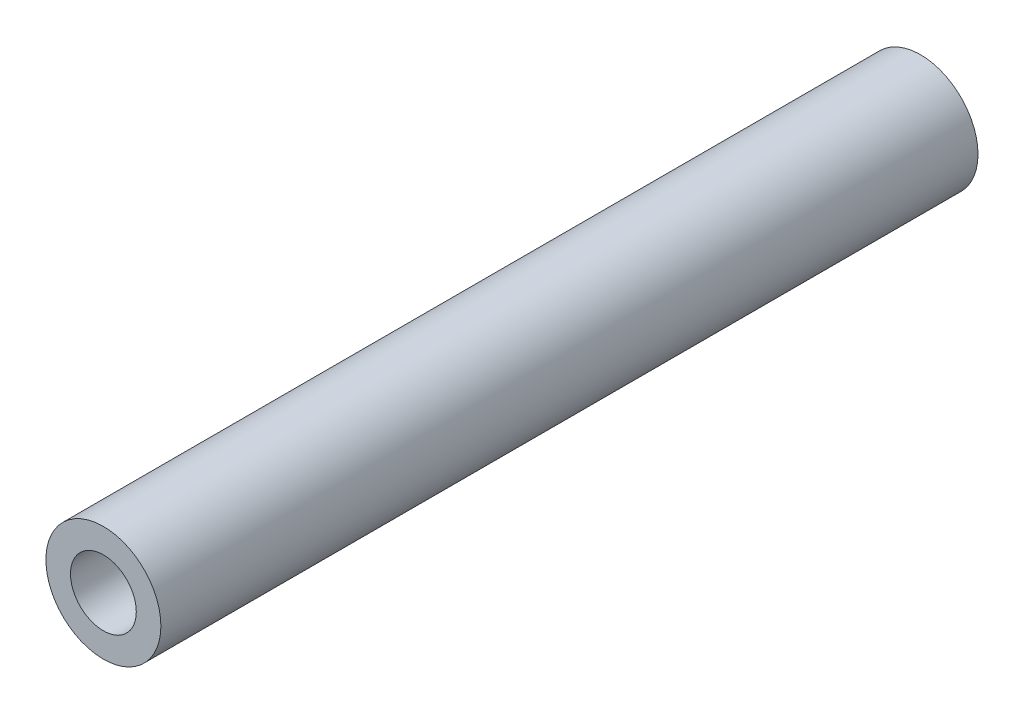
ISO-10303-21;
HEADER;
FILE_DESCRIPTION(('STEP AP214'),'2;1');
FILE_NAME('part.step','',(''),(''),'','','');
FILE_SCHEMA(('AUTOMOTIVE_DESIGN { 1 0 10303 214 1 1 1 1 }'));
ENDSEC;
DATA;
#1=APPLICATION_CONTEXT('core data for automotive mechanical design processes');
#2=APPLICATION_PROTOCOL_DEFINITION('international standard','automotive_design',2000,#1);
#3=PRODUCT_CONTEXT('',#1,'mechanical');
#4=PRODUCT('Part','Part','',(#3));
#5=PRODUCT_RELATED_PRODUCT_CATEGORY('part','',(#4));
#6=PRODUCT_DEFINITION_FORMATION('','',#4);
#7=PRODUCT_DEFINITION_CONTEXT('part definition',#1,'design');
#8=PRODUCT_DEFINITION('design','',#6,#7);
#9=PRODUCT_DEFINITION_SHAPE('','',#8);
#10=(LENGTH_UNIT() NAMED_UNIT(*) SI_UNIT(.MILLI.,.METRE.));
#11=(NAMED_UNIT(*) PLANE_ANGLE_UNIT() SI_UNIT($,.RADIAN.));
#12=(NAMED_UNIT(*) SI_UNIT($,.STERADIAN.) SOLID_ANGLE_UNIT());
#13=UNCERTAINTY_MEASURE_WITH_UNIT(LENGTH_MEASURE(1.E-05),#10,'distance_accuracy_value','');
#14=(GEOMETRIC_REPRESENTATION_CONTEXT(3) GLOBAL_UNCERTAINTY_ASSIGNED_CONTEXT((#13)) GLOBAL_UNIT_ASSIGNED_CONTEXT((#10,
#11,#12)) REPRESENTATION_CONTEXT('',''));
#15=CARTESIAN_POINT('',(0.,0.,0.));
#16=DIRECTION('',(0.,0.,1.));
#17=DIRECTION('',(1.,0.,0.));
#18=AXIS2_PLACEMENT_3D('',#15,#16,#17);
#19=CARTESIAN_POINT('',(1803.9911735505,-1743.84940911594,78.8956175875772));
#20=DIRECTION('',(0.,0.,-1.));
#21=DIRECTION('',(-1.,0.,0.));
#22=AXIS2_PLACEMENT_3D('',#19,#20,#21);
#23=CYLINDRICAL_SURFACE('',#22,4.63000000000001);
#24=CARTESIAN_POINT('',(1803.9911735505,-1743.84940911594,0.));
#25=DIRECTION('',(0.,0.,1.));
#26=DIRECTION('',(1.,0.,0.));
#27=AXIS2_PLACEMENT_3D('',#24,#25,#26);
#28=CIRCLE('',#27,4.63000000000001);
#29=CARTESIAN_POINT('',(1808.6211735505,-1743.84940911594,0.));
#30=VERTEX_POINT('',#29);
#31=EDGE_CURVE('E38',#30,#30,#28,.T.);
#32=ORIENTED_EDGE('',*,*,#31,.T.);
#33=EDGE_LOOP('',(#32));
#34=FACE_BOUND('',#33,.T.);
#35=CARTESIAN_POINT('',(1803.9911735505,-1743.84940911594,65.8000000000026));
#36=DIRECTION('',(0.,0.,1.));
#37=DIRECTION('',(1.,0.,0.));
#38=AXIS2_PLACEMENT_3D('',#35,#36,#37);
#39=CIRCLE('',#38,4.63000000000001);
#40=CARTESIAN_POINT('',(1808.6211735505,-1743.84940911594,65.8000000000026));
#41=VERTEX_POINT('',#40);
#42=EDGE_CURVE('E10',#41,#41,#39,.T.);
#43=ORIENTED_EDGE('',*,*,#42,.F.);
#44=EDGE_LOOP('',(#43));
#45=FACE_BOUND('',#44,.T.);
#46=ADVANCED_FACE('F31',(#34,#45),#23,.T.);
#47=CARTESIAN_POINT('',(1803.9911735505,-1743.84940911594,0.));
#48=DIRECTION('',(0.,0.,1.));
#49=DIRECTION('',(1.,0.,0.));
#50=AXIS2_PLACEMENT_3D('',#47,#48,#49);
#51=PLANE('',#50);
#52=ORIENTED_EDGE('',*,*,#31,.F.);
#53=EDGE_LOOP('',(#52));
#54=FACE_BOUND('',#53,.T.);
#55=CARTESIAN_POINT('',(1803.9911735505,-1743.84940911594,0.));
#56=DIRECTION('',(0.,0.,1.));
#57=DIRECTION('',(1.,0.,0.));
#58=AXIS2_PLACEMENT_3D('',#55,#56,#57);
#59=CIRCLE('',#58,2.6500000000001);
#60=CARTESIAN_POINT('',(1806.6411735505,-1743.84940911594,0.));
#61=VERTEX_POINT('',#60);
#62=EDGE_CURVE('E43',#61,#61,#59,.T.);
#63=ORIENTED_EDGE('',*,*,#62,.T.);
#64=EDGE_LOOP('',(#63));
#65=FACE_BOUND('',#64,.T.);
#66=ADVANCED_FACE('F59',(#54,#65),#51,.F.);
#67=CARTESIAN_POINT('',(1803.9911735505,-1743.84940911594,78.8956175875772));
#68=DIRECTION('',(0.,0.,-1.));
#69=DIRECTION('',(-1.,0.,0.));
#70=AXIS2_PLACEMENT_3D('',#67,#68,#69);
#71=CYLINDRICAL_SURFACE('',#70,2.6500000000001);
#72=ORIENTED_EDGE('',*,*,#62,.F.);
#73=EDGE_LOOP('',(#72));
#74=FACE_BOUND('',#73,.T.);
#75=CARTESIAN_POINT('',(1803.9911735505,-1743.84940911594,65.8000000000026));
#76=DIRECTION('',(0.,0.,1.));
#77=DIRECTION('',(1.,0.,0.));
#78=AXIS2_PLACEMENT_3D('',#75,#76,#77);
#79=CIRCLE('',#78,2.6500000000001);
#80=CARTESIAN_POINT('',(1806.6411735505,-1743.84940911594,65.8000000000026));
#81=VERTEX_POINT('',#80);
#82=EDGE_CURVE('E34',#81,#81,#79,.T.);
#83=ORIENTED_EDGE('',*,*,#82,.T.);
#84=EDGE_LOOP('',(#83));
#85=FACE_BOUND('',#84,.T.);
#86=ADVANCED_FACE('F51',(#74,#85),#71,.F.);
#87=CARTESIAN_POINT('',(1806.28336941063,-1743.60519990485,65.8000000000026));
#88=DIRECTION('',(0.,0.,1.));
#89=DIRECTION('',(-0.628216763509586,-0.778038365407222,0.));
#90=AXIS2_PLACEMENT_3D('',#87,#88,#89);
#91=PLANE('',#90);
#92=ORIENTED_EDGE('',*,*,#82,.F.);
#93=EDGE_LOOP('',(#92));
#94=FACE_BOUND('',#93,.T.);
#95=ORIENTED_EDGE('',*,*,#42,.T.);
#96=EDGE_LOOP('',(#95));
#97=FACE_BOUND('',#96,.T.);
#98=ADVANCED_FACE('F53',(#94,#97),#91,.T.);
#99=CLOSED_SHELL('',(#46,#66,#86,#98));
#100=MANIFOLD_SOLID_BREP('B2',#99);
#101=ADVANCED_BREP_SHAPE_REPRESENTATION('',(#18,#100),#14);
#102=SHAPE_DEFINITION_REPRESENTATION(#9,#101);
ENDSEC;
END-ISO-10303-21;
